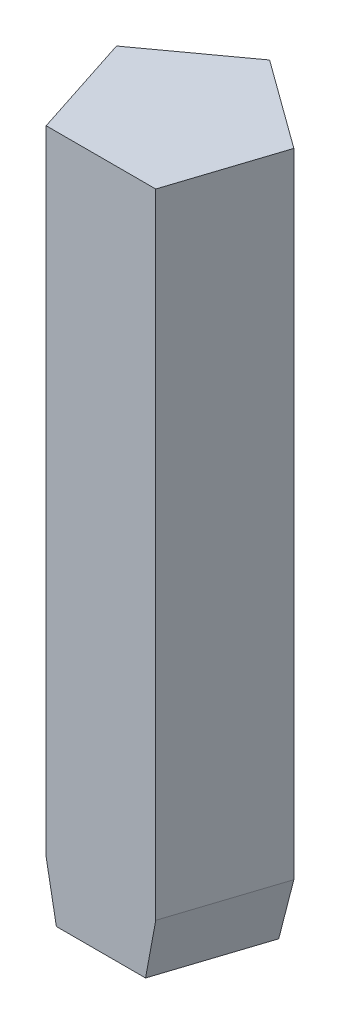
ISO-10303-21;
HEADER;
FILE_DESCRIPTION(('STEP AP214'),'2;1');
FILE_NAME('part.step','',(''),(''),'','','');
FILE_SCHEMA(('AUTOMOTIVE_DESIGN { 1 0 10303 214 1 1 1 1 }'));
ENDSEC;
DATA;
#1=APPLICATION_CONTEXT('core data for automotive mechanical design processes');
#2=APPLICATION_PROTOCOL_DEFINITION('international standard','automotive_design',2000,#1);
#3=PRODUCT_CONTEXT('',#1,'mechanical');
#4=PRODUCT('Part','Part','',(#3));
#5=PRODUCT_RELATED_PRODUCT_CATEGORY('part','',(#4));
#6=PRODUCT_DEFINITION_FORMATION('','',#4);
#7=PRODUCT_DEFINITION_CONTEXT('part definition',#1,'design');
#8=PRODUCT_DEFINITION('design','',#6,#7);
#9=PRODUCT_DEFINITION_SHAPE('','',#8);
#10=(LENGTH_UNIT() NAMED_UNIT(*) SI_UNIT(.MILLI.,.METRE.));
#11=(NAMED_UNIT(*) PLANE_ANGLE_UNIT() SI_UNIT($,.RADIAN.));
#12=(NAMED_UNIT(*) SI_UNIT($,.STERADIAN.) SOLID_ANGLE_UNIT());
#13=UNCERTAINTY_MEASURE_WITH_UNIT(LENGTH_MEASURE(1.E-05),#10,'distance_accuracy_value','');
#14=(GEOMETRIC_REPRESENTATION_CONTEXT(3) GLOBAL_UNCERTAINTY_ASSIGNED_CONTEXT((#13)) GLOBAL_UNIT_ASSIGNED_CONTEXT((#10,
#11,#12)) REPRESENTATION_CONTEXT('',''));
#15=CARTESIAN_POINT('',(0.,0.,0.));
#16=DIRECTION('',(0.,0.,1.));
#17=DIRECTION('',(1.,0.,0.));
#18=AXIS2_PLACEMENT_3D('',#15,#16,#17);
#19=CARTESIAN_POINT('',(6.43977527522458,50.,-2.09240982623416));
#20=DIRECTION('',(-0.587785252292472,0.,0.809016994374948));
#21=DIRECTION('',(0.809016994374948,0.,0.587785252292472));
#22=AXIS2_PLACEMENT_3D('',#19,#20,#21);
#23=PLANE('',#22);
#24=DIRECTION('',(0.,-1.,0.));
#25=VECTOR('',#24,1.);
#26=CARTESIAN_POINT('',(6.43977527522458,50.,-2.09240982623416));
#27=LINE('',#26,#25);
#28=CARTESIAN_POINT('',(6.43977527522458,50.,-2.09240982623416));
#29=VERTEX_POINT('',#28);
#30=CARTESIAN_POINT('',(6.43977527522458,4.00000000000009,-2.09240982623416));
#31=VERTEX_POINT('',#30);
#32=EDGE_CURVE('E165',#29,#31,#27,.T.);
#33=ORIENTED_EDGE('',*,*,#32,.T.);
#34=DIRECTION('',(-0.809016994374948,0.,-0.587785252292472));
#35=VECTOR('',#34,1.);
#36=CARTESIAN_POINT('',(6.43977527522458,4.00000000000009,-2.09240982623416));
#37=LINE('',#36,#35);
#38=CARTESIAN_POINT('',(0.,4.00000000000007,-6.77118043448224));
#39=VERTEX_POINT('',#38);
#40=EDGE_CURVE('E70',#31,#39,#37,.T.);
#41=ORIENTED_EDGE('',*,*,#40,.T.);
#42=DIRECTION('',(0.,-1.,0.));
#43=VECTOR('',#42,1.);
#44=CARTESIAN_POINT('',(0.,50.,-6.77118043448224));
#45=LINE('',#44,#43);
#46=CARTESIAN_POINT('',(0.,50.,-6.77118043448224));
#47=VERTEX_POINT('',#46);
#48=EDGE_CURVE('E111',#47,#39,#45,.T.);
#49=ORIENTED_EDGE('',*,*,#48,.F.);
#50=DIRECTION('',(-0.809016994374948,0.,-0.587785252292472));
#51=VECTOR('',#50,1.);
#52=CARTESIAN_POINT('',(6.43977527522458,50.,-2.09240982623416));
#53=LINE('',#52,#51);
#54=EDGE_CURVE('E116',#29,#47,#53,.T.);
#55=ORIENTED_EDGE('',*,*,#54,.F.);
#56=EDGE_LOOP('',(#33,#41,#49,#55));
#57=FACE_BOUND('',#56,.T.);
#58=ADVANCED_FACE('F45',(#57),#23,.F.);
#59=CARTESIAN_POINT('',(0.,50.,-6.77118043448224));
#60=DIRECTION('',(0.587785252292474,0.,0.809016994374947));
#61=DIRECTION('',(0.809016994374947,0.,-0.587785252292474));
#62=AXIS2_PLACEMENT_3D('',#59,#60,#61);
#63=PLANE('',#62);
#64=ORIENTED_EDGE('',*,*,#48,.T.);
#65=DIRECTION('',(-0.809016994374947,0.,0.587785252292474));
#66=VECTOR('',#65,1.);
#67=CARTESIAN_POINT('',(0.,4.00000000000007,-6.77118043448224));
#68=LINE('',#67,#66);
#69=CARTESIAN_POINT('',(-6.43977527522458,4.00000000000007,-2.09240982623415));
#70=VERTEX_POINT('',#69);
#71=EDGE_CURVE('E55',#39,#70,#68,.T.);
#72=ORIENTED_EDGE('',*,*,#71,.T.);
#73=DIRECTION('',(0.,-1.,0.));
#74=VECTOR('',#73,1.);
#75=CARTESIAN_POINT('',(-6.43977527522458,50.,-2.09240982623415));
#76=LINE('',#75,#74);
#77=CARTESIAN_POINT('',(-6.43977527522458,50.,-2.09240982623415));
#78=VERTEX_POINT('',#77);
#79=EDGE_CURVE('E112',#78,#70,#76,.T.);
#80=ORIENTED_EDGE('',*,*,#79,.F.);
#81=DIRECTION('',(-0.809016994374947,0.,0.587785252292474));
#82=VECTOR('',#81,1.);
#83=CARTESIAN_POINT('',(0.,50.,-6.77118043448224));
#84=LINE('',#83,#82);
#85=EDGE_CURVE('E108',#47,#78,#84,.T.);
#86=ORIENTED_EDGE('',*,*,#85,.F.);
#87=EDGE_LOOP('',(#64,#72,#80,#86));
#88=FACE_BOUND('',#87,.T.);
#89=ADVANCED_FACE('F110',(#88),#63,.F.);
#90=CARTESIAN_POINT('',(-6.43977527522458,50.,-2.09240982623415));
#91=DIRECTION('',(0.951056516295153,0.,-0.309016994374948));
#92=DIRECTION('',(-0.309016994374948,0.,-0.951056516295153));
#93=AXIS2_PLACEMENT_3D('',#90,#91,#92);
#94=PLANE('',#93);
#95=ORIENTED_EDGE('',*,*,#79,.T.);
#96=DIRECTION('',(0.309016994374948,0.,0.951056516295153));
#97=VECTOR('',#96,1.);
#98=CARTESIAN_POINT('',(-6.43977527522458,4.00000000000007,-2.09240982623415));
#99=LINE('',#98,#97);
#100=CARTESIAN_POINT('',(-3.97999999999999,4.00000000000007,5.47800004347527));
#101=VERTEX_POINT('',#100);
#102=EDGE_CURVE('E11',#70,#101,#99,.T.);
#103=ORIENTED_EDGE('',*,*,#102,.T.);
#104=DIRECTION('',(0.,-1.,0.));
#105=VECTOR('',#104,1.);
#106=CARTESIAN_POINT('',(-3.97999999999999,50.,5.47800004347527));
#107=LINE('',#106,#105);
#108=CARTESIAN_POINT('',(-3.97999999999999,50.,5.47800004347527));
#109=VERTEX_POINT('',#108);
#110=EDGE_CURVE('E130',#109,#101,#107,.T.);
#111=ORIENTED_EDGE('',*,*,#110,.F.);
#112=DIRECTION('',(0.309016994374948,0.,0.951056516295153));
#113=VECTOR('',#112,1.);
#114=CARTESIAN_POINT('',(-6.43977527522458,50.,-2.09240982623415));
#115=LINE('',#114,#113);
#116=EDGE_CURVE('E115',#78,#109,#115,.T.);
#117=ORIENTED_EDGE('',*,*,#116,.F.);
#118=EDGE_LOOP('',(#95,#103,#111,#117));
#119=FACE_BOUND('',#118,.T.);
#120=ADVANCED_FACE('F191',(#119),#94,.F.);
#121=CARTESIAN_POINT('',(-3.97999999999999,50.,5.47800004347527));
#122=DIRECTION('',(0.,0.,-1.));
#123=DIRECTION('',(-1.,0.,0.));
#124=AXIS2_PLACEMENT_3D('',#121,#122,#123);
#125=PLANE('',#124);
#126=DIRECTION('',(1.,0.,0.));
#127=VECTOR('',#126,1.);
#128=CARTESIAN_POINT('',(-3.97999999999999,0.,5.47800004347527));
#129=LINE('',#128,#127);
#130=CARTESIAN_POINT('',(-3.23839536268423,0.,5.47800004347527));
#131=VERTEX_POINT('',#130);
#132=CARTESIAN_POINT('',(3.23839536268424,0.,5.47800004347527));
#133=VERTEX_POINT('',#132);
#134=EDGE_CURVE('E123',#131,#133,#129,.T.);
#135=ORIENTED_EDGE('',*,*,#134,.T.);
#136=DIRECTION('',(-0.182294570528351,-0.983243962379574,0.));
#137=VECTOR('',#136,1.);
#138=CARTESIAN_POINT('',(3.98000000000001,4.00000000000008,5.47800004347527));
#139=LINE('',#138,#137);
#140=CARTESIAN_POINT('',(3.98000000000001,4.00000000000009,5.47800004347527));
#141=VERTEX_POINT('',#140);
#142=EDGE_CURVE('E143',#133,#141,#139,.F.);
#143=ORIENTED_EDGE('',*,*,#142,.T.);
#144=DIRECTION('',(0.,-1.,0.));
#145=VECTOR('',#144,1.);
#146=CARTESIAN_POINT('',(3.98000000000001,50.,5.47800004347527));
#147=LINE('',#146,#145);
#148=CARTESIAN_POINT('',(3.98000000000001,50.,5.47800004347527));
#149=VERTEX_POINT('',#148);
#150=EDGE_CURVE('E167',#149,#141,#147,.T.);
#151=ORIENTED_EDGE('',*,*,#150,.F.);
#152=DIRECTION('',(1.,0.,0.));
#153=VECTOR('',#152,1.);
#154=CARTESIAN_POINT('',(-3.97999999999999,50.,5.47800004347527));
#155=LINE('',#154,#153);
#156=EDGE_CURVE('E175',#109,#149,#155,.T.);
#157=ORIENTED_EDGE('',*,*,#156,.F.);
#158=ORIENTED_EDGE('',*,*,#110,.T.);
#159=DIRECTION('',(-0.182294570528351,0.983243962379574,0.));
#160=VECTOR('',#159,1.);
#161=CARTESIAN_POINT('',(-4.06174155579374,4.44089020850586,5.47800004347528));
#162=LINE('',#161,#160);
#163=EDGE_CURVE('E141',#101,#131,#162,.F.);
#164=ORIENTED_EDGE('',*,*,#163,.T.);
#165=EDGE_LOOP('',(#135,#143,#151,#157,#158,#164));
#166=FACE_BOUND('',#165,.T.);
#167=ADVANCED_FACE('F173',(#166),#125,.F.);
#168=CARTESIAN_POINT('',(3.98000000000001,50.,5.47800004347527));
#169=DIRECTION('',(-0.951056516295154,0.,-0.309016994374946));
#170=DIRECTION('',(-0.309016994374946,0.,0.951056516295154));
#171=AXIS2_PLACEMENT_3D('',#168,#169,#170);
#172=PLANE('',#171);
#173=ORIENTED_EDGE('',*,*,#150,.T.);
#174=DIRECTION('',(0.309016994374946,0.,-0.951056516295154));
#175=VECTOR('',#174,1.);
#176=CARTESIAN_POINT('',(3.98000000000001,4.00000000000009,5.47800004347527));
#177=LINE('',#176,#175);
#178=EDGE_CURVE('E125',#141,#31,#177,.T.);
#179=ORIENTED_EDGE('',*,*,#178,.T.);
#180=ORIENTED_EDGE('',*,*,#32,.F.);
#181=DIRECTION('',(0.309016994374946,0.,-0.951056516295154));
#182=VECTOR('',#181,1.);
#183=CARTESIAN_POINT('',(3.98000000000001,50.,5.47800004347527));
#184=LINE('',#183,#182);
#185=EDGE_CURVE('E121',#149,#29,#184,.T.);
#186=ORIENTED_EDGE('',*,*,#185,.F.);
#187=EDGE_LOOP('',(#173,#179,#180,#186));
#188=FACE_BOUND('',#187,.T.);
#189=ADVANCED_FACE('F189',(#188),#172,.F.);
#190=CARTESIAN_POINT('',(0.,50.,0.));
#191=DIRECTION('',(0.,1.,0.));
#192=DIRECTION('',(0.,0.,1.));
#193=AXIS2_PLACEMENT_3D('',#190,#191,#192);
#194=PLANE('',#193);
#195=ORIENTED_EDGE('',*,*,#54,.T.);
#196=ORIENTED_EDGE('',*,*,#85,.T.);
#197=ORIENTED_EDGE('',*,*,#116,.T.);
#198=ORIENTED_EDGE('',*,*,#156,.T.);
#199=ORIENTED_EDGE('',*,*,#185,.T.);
#200=EDGE_LOOP('',(#195,#196,#197,#198,#199));
#201=FACE_BOUND('',#200,.T.);
#202=ADVANCED_FACE('F119',(#201),#194,.T.);
#203=CARTESIAN_POINT('',(0.,0.,0.));
#204=DIRECTION('',(0.,1.,0.));
#205=DIRECTION('',(0.,0.,1.));
#206=AXIS2_PLACEMENT_3D('',#203,#204,#205);
#207=PLANE('',#206);
#208=DIRECTION('',(0.809016994374948,0.,0.587785252292472));
#209=VECTOR('',#208,1.);
#210=CARTESIAN_POINT('',(2.8053180422455,0.,-3.86118903451831));
#211=LINE('',#210,#209);
#212=CARTESIAN_POINT('',(0.,0.,-5.89937189679041));
#213=VERTEX_POINT('',#212);
#214=CARTESIAN_POINT('',(5.61063608449102,0.,-1.82300617224621));
#215=VERTEX_POINT('',#214);
#216=EDGE_CURVE('E137',#213,#215,#211,.T.);
#217=ORIENTED_EDGE('',*,*,#216,.T.);
#218=DIRECTION('',(-0.309016994374946,0.,0.951056516295154));
#219=VECTOR('',#218,1.);
#220=CARTESIAN_POINT('',(4.53909994160655,0.,1.4748429741976));
#221=LINE('',#220,#219);
#222=EDGE_CURVE('E139',#215,#133,#221,.T.);
#223=ORIENTED_EDGE('',*,*,#222,.T.);
#224=ORIENTED_EDGE('',*,*,#134,.F.);
#225=DIRECTION('',(-0.309016994374948,0.,-0.951056516295154));
#226=VECTOR('',#225,1.);
#227=CARTESIAN_POINT('',(-4.53909994160655,0.,1.47484297419761));
#228=LINE('',#227,#226);
#229=CARTESIAN_POINT('',(-5.61063608449102,0.,-1.8230061722462));
#230=VERTEX_POINT('',#229);
#231=EDGE_CURVE('E128',#131,#230,#228,.T.);
#232=ORIENTED_EDGE('',*,*,#231,.T.);
#233=DIRECTION('',(0.809016994374947,0.,-0.587785252292474));
#234=VECTOR('',#233,1.);
#235=CARTESIAN_POINT('',(-2.80531804224551,0.,-3.86118903451831));
#236=LINE('',#235,#234);
#237=EDGE_CURVE('E135',#230,#213,#236,.T.);
#238=ORIENTED_EDGE('',*,*,#237,.T.);
#239=EDGE_LOOP('',(#217,#223,#224,#232,#238));
#240=FACE_BOUND('',#239,.T.);
#241=ADVANCED_FACE('F181',(#240),#207,.F.);
#242=CARTESIAN_POINT('',(-6.43977527522458,4.00000000000008,-2.09240982623415));
#243=DIRECTION('',(0.936607830800249,0.173648177666927,-0.304322331872979));
#244=DIRECTION('',(0.309016994374948,0.,0.951056516295154));
#245=AXIS2_PLACEMENT_3D('',#242,#243,#244);
#246=PLANE('',#245);
#247=ORIENTED_EDGE('',*,*,#163,.F.);
#248=ORIENTED_EDGE('',*,*,#102,.F.);
#249=DIRECTION('',(0.202530197739813,-0.977062476376896,0.0658060503276103));
#250=VECTOR('',#249,1.);
#251=CARTESIAN_POINT('',(-6.43977527522458,4.00000000000008,-2.09240982623415));
#252=LINE('',#251,#250);
#253=EDGE_CURVE('E50',#230,#70,#252,.F.);
#254=ORIENTED_EDGE('',*,*,#253,.F.);
#255=ORIENTED_EDGE('',*,*,#231,.F.);
#256=EDGE_LOOP('',(#247,#248,#254,#255));
#257=FACE_BOUND('',#256,.T.);
#258=ADVANCED_FACE('F48',(#257),#246,.F.);
#259=CARTESIAN_POINT('',(0.,4.00000000000008,-6.77118043448224));
#260=DIRECTION('',(0.578855473563865,0.173648177666927,0.796726208379082));
#261=DIRECTION('',(-0.809016994374947,0.,0.587785252292474));
#262=AXIS2_PLACEMENT_3D('',#259,#260,#261);
#263=PLANE('',#262);
#264=ORIENTED_EDGE('',*,*,#253,.T.);
#265=ORIENTED_EDGE('',*,*,#71,.F.);
#266=DIRECTION('',(0.,-0.977062476376896,0.21295285219092));
#267=VECTOR('',#266,1.);
#268=CARTESIAN_POINT('',(0.,4.00000000000008,-6.77118043448224));
#269=LINE('',#268,#267);
#270=EDGE_CURVE('E148',#213,#39,#269,.F.);
#271=ORIENTED_EDGE('',*,*,#270,.F.);
#272=ORIENTED_EDGE('',*,*,#237,.F.);
#273=EDGE_LOOP('',(#264,#265,#271,#272));
#274=FACE_BOUND('',#273,.T.);
#275=ADVANCED_FACE('F215',(#274),#263,.F.);
#276=CARTESIAN_POINT('',(6.43977527522458,4.00000000000008,-2.09240982623416));
#277=DIRECTION('',(-0.578855473563864,0.173648177666927,0.796726208379083));
#278=DIRECTION('',(-0.809016994374948,0.,-0.587785252292472));
#279=AXIS2_PLACEMENT_3D('',#276,#277,#278);
#280=PLANE('',#279);
#281=ORIENTED_EDGE('',*,*,#270,.T.);
#282=ORIENTED_EDGE('',*,*,#40,.F.);
#283=DIRECTION('',(-0.202530197739813,-0.977062476376896,0.0658060503276108));
#284=VECTOR('',#283,1.);
#285=CARTESIAN_POINT('',(6.43977527522458,4.00000000000008,-2.09240982623416));
#286=LINE('',#285,#284);
#287=EDGE_CURVE('E147',#215,#31,#286,.F.);
#288=ORIENTED_EDGE('',*,*,#287,.F.);
#289=ORIENTED_EDGE('',*,*,#216,.F.);
#290=EDGE_LOOP('',(#281,#282,#288,#289));
#291=FACE_BOUND('',#290,.T.);
#292=ADVANCED_FACE('F187',(#291),#280,.F.);
#293=CARTESIAN_POINT('',(3.98000000000001,4.00000000000008,5.47800004347527));
#294=DIRECTION('',(-0.93660783080025,0.173648177666927,-0.304322331872977));
#295=DIRECTION('',(0.309016994374946,0.,-0.951056516295154));
#296=AXIS2_PLACEMENT_3D('',#293,#294,#295);
#297=PLANE('',#296);
#298=ORIENTED_EDGE('',*,*,#142,.F.);
#299=ORIENTED_EDGE('',*,*,#222,.F.);
#300=ORIENTED_EDGE('',*,*,#287,.T.);
#301=ORIENTED_EDGE('',*,*,#178,.F.);
#302=EDGE_LOOP('',(#298,#299,#300,#301));
#303=FACE_BOUND('',#302,.T.);
#304=ADVANCED_FACE('F185',(#303),#297,.F.);
#305=CLOSED_SHELL('',(#58,#89,#120,#167,#189,#202,#241,#258,#275,#292,#304));
#306=MANIFOLD_SOLID_BREP('B2',#305);
#307=ADVANCED_BREP_SHAPE_REPRESENTATION('',(#18,#306),#14);
#308=SHAPE_DEFINITION_REPRESENTATION(#9,#307);
ENDSEC;
END-ISO-10303-21;
